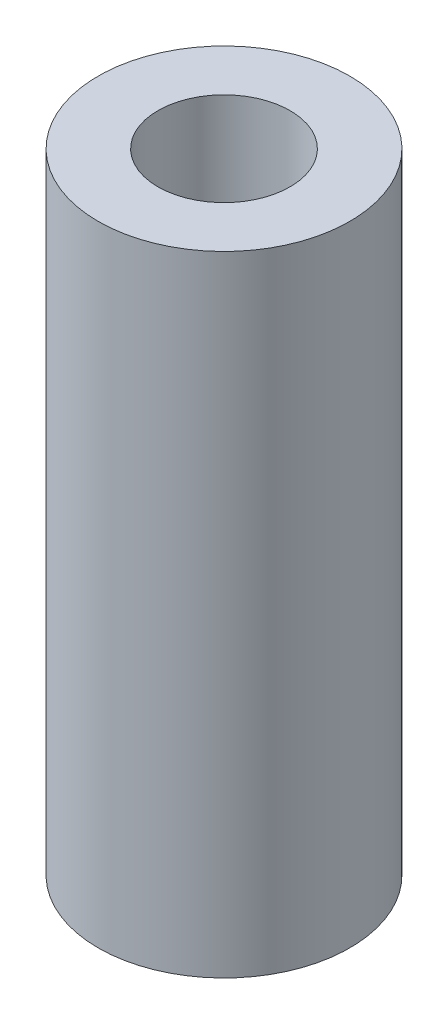
ISO-10303-21;
HEADER;
FILE_DESCRIPTION(('STEP AP214'),'2;1');
FILE_NAME('part.step','',(''),(''),'','','');
FILE_SCHEMA(('AUTOMOTIVE_DESIGN { 1 0 10303 214 1 1 1 1 }'));
ENDSEC;
DATA;
#1=APPLICATION_CONTEXT('core data for automotive mechanical design processes');
#2=APPLICATION_PROTOCOL_DEFINITION('international standard','automotive_design',2000,#1);
#3=PRODUCT_CONTEXT('',#1,'mechanical');
#4=PRODUCT('Part','Part','',(#3));
#5=PRODUCT_RELATED_PRODUCT_CATEGORY('part','',(#4));
#6=PRODUCT_DEFINITION_FORMATION('','',#4);
#7=PRODUCT_DEFINITION_CONTEXT('part definition',#1,'design');
#8=PRODUCT_DEFINITION('design','',#6,#7);
#9=PRODUCT_DEFINITION_SHAPE('','',#8);
#10=(LENGTH_UNIT() NAMED_UNIT(*) SI_UNIT(.MILLI.,.METRE.));
#11=(NAMED_UNIT(*) PLANE_ANGLE_UNIT() SI_UNIT($,.RADIAN.));
#12=(NAMED_UNIT(*) SI_UNIT($,.STERADIAN.) SOLID_ANGLE_UNIT());
#13=UNCERTAINTY_MEASURE_WITH_UNIT(LENGTH_MEASURE(1.E-05),#10,'distance_accuracy_value','');
#14=(GEOMETRIC_REPRESENTATION_CONTEXT(3) GLOBAL_UNCERTAINTY_ASSIGNED_CONTEXT((#13)) GLOBAL_UNIT_ASSIGNED_CONTEXT((#10,
#11,#12)) REPRESENTATION_CONTEXT('',''));
#15=CARTESIAN_POINT('',(0.,0.,0.));
#16=DIRECTION('',(0.,0.,1.));
#17=DIRECTION('',(1.,0.,0.));
#18=AXIS2_PLACEMENT_3D('',#15,#16,#17);
#19=CARTESIAN_POINT('',(0.,20.,0.));
#20=DIRECTION('',(0.,1.,0.));
#21=DIRECTION('',(0.,0.,1.));
#22=AXIS2_PLACEMENT_3D('',#19,#20,#21);
#23=PLANE('',#22);
#24=CARTESIAN_POINT('',(0.,20.,0.));
#25=DIRECTION('',(0.,1.,0.));
#26=DIRECTION('',(0.,0.,1.));
#27=AXIS2_PLACEMENT_3D('',#24,#25,#26);
#28=CIRCLE('',#27,4.);
#29=CARTESIAN_POINT('',(0.,20.,4.));
#30=VERTEX_POINT('',#29);
#31=EDGE_CURVE('E10',#30,#30,#28,.T.);
#32=ORIENTED_EDGE('',*,*,#31,.T.);
#33=EDGE_LOOP('',(#32));
#34=FACE_BOUND('',#33,.T.);
#35=CARTESIAN_POINT('',(0.,20.,0.));
#36=DIRECTION('',(0.,1.,0.));
#37=DIRECTION('',(0.,0.,1.));
#38=AXIS2_PLACEMENT_3D('',#35,#36,#37);
#39=CIRCLE('',#38,2.1);
#40=CARTESIAN_POINT('',(0.,20.,2.1));
#41=VERTEX_POINT('',#40);
#42=EDGE_CURVE('E46',#41,#41,#39,.T.);
#43=ORIENTED_EDGE('',*,*,#42,.F.);
#44=EDGE_LOOP('',(#43));
#45=FACE_BOUND('',#44,.T.);
#46=ADVANCED_FACE('F35',(#34,#45),#23,.T.);
#47=CARTESIAN_POINT('',(0.,0.,0.));
#48=DIRECTION('',(0.,1.,0.));
#49=DIRECTION('',(0.,0.,1.));
#50=AXIS2_PLACEMENT_3D('',#47,#48,#49);
#51=PLANE('',#50);
#52=CARTESIAN_POINT('',(0.,0.,0.));
#53=DIRECTION('',(0.,1.,0.));
#54=DIRECTION('',(0.,0.,1.));
#55=AXIS2_PLACEMENT_3D('',#52,#53,#54);
#56=CIRCLE('',#55,4.);
#57=CARTESIAN_POINT('',(0.,0.,4.));
#58=VERTEX_POINT('',#57);
#59=EDGE_CURVE('E39',#58,#58,#56,.T.);
#60=ORIENTED_EDGE('',*,*,#59,.F.);
#61=EDGE_LOOP('',(#60));
#62=FACE_BOUND('',#61,.T.);
#63=CARTESIAN_POINT('',(0.,0.,0.));
#64=DIRECTION('',(0.,1.,0.));
#65=DIRECTION('',(0.,0.,1.));
#66=AXIS2_PLACEMENT_3D('',#63,#64,#65);
#67=CIRCLE('',#66,2.1);
#68=CARTESIAN_POINT('',(0.,0.,2.1));
#69=VERTEX_POINT('',#68);
#70=EDGE_CURVE('E48',#69,#69,#67,.T.);
#71=ORIENTED_EDGE('',*,*,#70,.T.);
#72=EDGE_LOOP('',(#71));
#73=FACE_BOUND('',#72,.T.);
#74=ADVANCED_FACE('F58',(#62,#73),#51,.F.);
#75=CARTESIAN_POINT('',(0.,20.,0.));
#76=DIRECTION('',(0.,-1.,0.));
#77=DIRECTION('',(0.,0.,-1.));
#78=AXIS2_PLACEMENT_3D('',#75,#76,#77);
#79=CYLINDRICAL_SURFACE('',#78,4.);
#80=ORIENTED_EDGE('',*,*,#31,.F.);
#81=EDGE_LOOP('',(#80));
#82=FACE_BOUND('',#81,.T.);
#83=ORIENTED_EDGE('',*,*,#59,.T.);
#84=EDGE_LOOP('',(#83));
#85=FACE_BOUND('',#84,.T.);
#86=ADVANCED_FACE('F37',(#82,#85),#79,.T.);
#87=CARTESIAN_POINT('',(0.,20.,0.));
#88=DIRECTION('',(0.,-1.,0.));
#89=DIRECTION('',(0.,0.,-1.));
#90=AXIS2_PLACEMENT_3D('',#87,#88,#89);
#91=CYLINDRICAL_SURFACE('',#90,2.1);
#92=ORIENTED_EDGE('',*,*,#42,.T.);
#93=EDGE_LOOP('',(#92));
#94=FACE_BOUND('',#93,.T.);
#95=ORIENTED_EDGE('',*,*,#70,.F.);
#96=EDGE_LOOP('',(#95));
#97=FACE_BOUND('',#96,.T.);
#98=ADVANCED_FACE('F54',(#94,#97),#91,.F.);
#99=CLOSED_SHELL('',(#46,#74,#86,#98));
#100=MANIFOLD_SOLID_BREP('B2',#99);
#101=ADVANCED_BREP_SHAPE_REPRESENTATION('',(#18,#100),#14);
#102=SHAPE_DEFINITION_REPRESENTATION(#9,#101);
ENDSEC;
END-ISO-10303-21;
